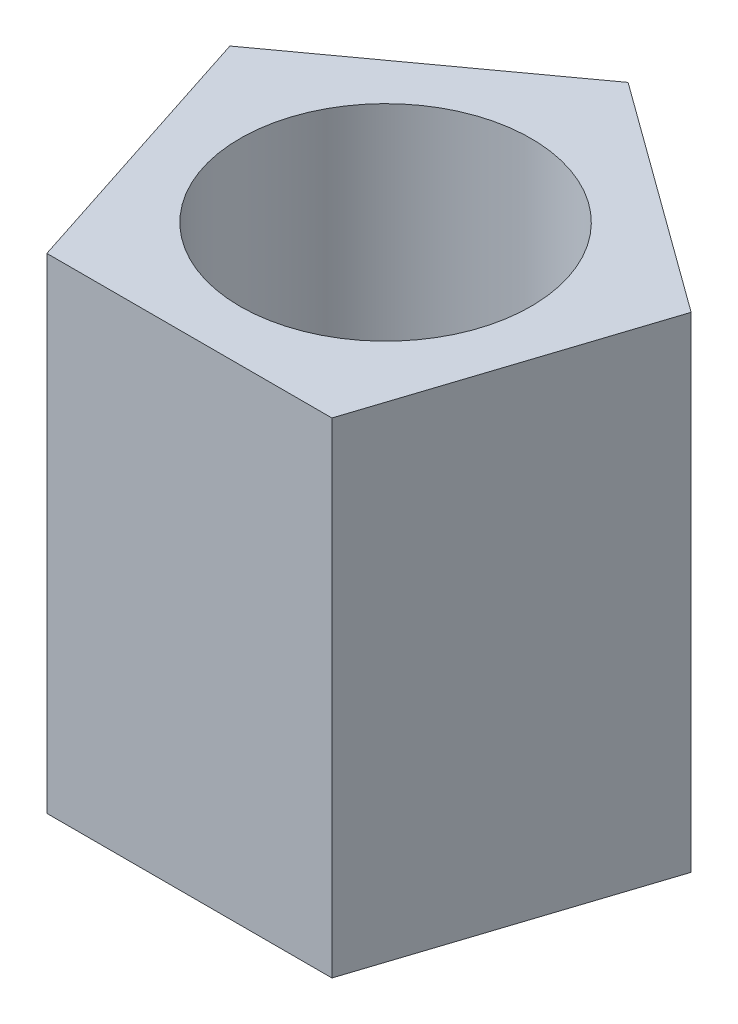
ISO-10303-21;
HEADER;
FILE_DESCRIPTION(('STEP AP214'),'2;1');
FILE_NAME('part.step','',(''),(''),'','','');
FILE_SCHEMA(('AUTOMOTIVE_DESIGN { 1 0 10303 214 1 1 1 1 }'));
ENDSEC;
DATA;
#1=APPLICATION_CONTEXT('core data for automotive mechanical design processes');
#2=APPLICATION_PROTOCOL_DEFINITION('international standard','automotive_design',2000,#1);
#3=PRODUCT_CONTEXT('',#1,'mechanical');
#4=PRODUCT('Part','Part','',(#3));
#5=PRODUCT_RELATED_PRODUCT_CATEGORY('part','',(#4));
#6=PRODUCT_DEFINITION_FORMATION('','',#4);
#7=PRODUCT_DEFINITION_CONTEXT('part definition',#1,'design');
#8=PRODUCT_DEFINITION('design','',#6,#7);
#9=PRODUCT_DEFINITION_SHAPE('','',#8);
#10=(LENGTH_UNIT() NAMED_UNIT(*) SI_UNIT(.MILLI.,.METRE.));
#11=(NAMED_UNIT(*) PLANE_ANGLE_UNIT() SI_UNIT($,.RADIAN.));
#12=(NAMED_UNIT(*) SI_UNIT($,.STERADIAN.) SOLID_ANGLE_UNIT());
#13=UNCERTAINTY_MEASURE_WITH_UNIT(LENGTH_MEASURE(1.E-05),#10,'distance_accuracy_value','');
#14=(GEOMETRIC_REPRESENTATION_CONTEXT(3) GLOBAL_UNCERTAINTY_ASSIGNED_CONTEXT((#13)) GLOBAL_UNIT_ASSIGNED_CONTEXT((#10,
#11,#12)) REPRESENTATION_CONTEXT('',''));
#15=CARTESIAN_POINT('',(0.,0.,0.));
#16=DIRECTION('',(0.,0.,1.));
#17=DIRECTION('',(1.,0.,0.));
#18=AXIS2_PLACEMENT_3D('',#15,#16,#17);
#19=CARTESIAN_POINT('',(6.03920887847423,22.0206850004623,-1.9622579142809));
#20=DIRECTION('',(0.951056516295152,0.,0.309016994374951));
#21=DIRECTION('',(0.309016994374951,0.,-0.951056516295152));
#22=AXIS2_PLACEMENT_3D('',#19,#20,#21);
#23=PLANE('',#22);
#24=DIRECTION('',(0.,-1.,0.));
#25=VECTOR('',#24,1.);
#26=CARTESIAN_POINT('',(6.03920887847423,21.4632496185971,-1.9622579142809));
#27=LINE('',#26,#25);
#28=CARTESIAN_POINT('',(6.03920887847423,12.7,-1.9622579142809));
#29=VERTEX_POINT('',#28);
#30=CARTESIAN_POINT('',(6.03920887847423,0.,-1.9622579142809));
#31=VERTEX_POINT('',#30);
#32=EDGE_CURVE('E48',#29,#31,#27,.T.);
#33=ORIENTED_EDGE('',*,*,#32,.F.);
#34=DIRECTION('',(-0.309016994374951,0.,0.951056516295152));
#35=VECTOR('',#34,1.);
#36=CARTESIAN_POINT('',(6.03920887847423,12.7,-1.9622579142809));
#37=LINE('',#36,#35);
#38=CARTESIAN_POINT('',(3.73243635205718,12.7,5.13725791428094));
#39=VERTEX_POINT('',#38);
#40=EDGE_CURVE('E122',#29,#39,#37,.T.);
#41=ORIENTED_EDGE('',*,*,#40,.T.);
#42=DIRECTION('',(0.,-1.,0.));
#43=VECTOR('',#42,1.);
#44=CARTESIAN_POINT('',(3.73243635205718,22.0206850004623,5.13725791428094));
#45=LINE('',#44,#43);
#46=CARTESIAN_POINT('',(3.73243635205718,0.,5.13725791428094));
#47=VERTEX_POINT('',#46);
#48=EDGE_CURVE('E86',#39,#47,#45,.T.);
#49=ORIENTED_EDGE('',*,*,#48,.T.);
#50=DIRECTION('',(-0.309016994374951,0.,0.951056516295153));
#51=VECTOR('',#50,1.);
#52=CARTESIAN_POINT('',(6.03920887847423,0.,-1.9622579142809));
#53=LINE('',#52,#51);
#54=EDGE_CURVE('E120',#31,#47,#53,.T.);
#55=ORIENTED_EDGE('',*,*,#54,.F.);
#56=EDGE_LOOP('',(#33,#41,#49,#55));
#57=FACE_BOUND('',#56,.T.);
#58=ADVANCED_FACE('F39',(#57),#23,.T.);
#59=CARTESIAN_POINT('',(3.73243635205718,21.7617737428428,5.13725791428094));
#60=DIRECTION('',(0.,0.,1.));
#61=DIRECTION('',(1.,0.,0.));
#62=AXIS2_PLACEMENT_3D('',#59,#60,#61);
#63=PLANE('',#62);
#64=ORIENTED_EDGE('',*,*,#48,.F.);
#65=DIRECTION('',(-1.,0.,0.));
#66=VECTOR('',#65,1.);
#67=CARTESIAN_POINT('',(3.73243635205718,12.7,5.13725791428094));
#68=LINE('',#67,#66);
#69=CARTESIAN_POINT('',(-3.73243635205725,12.7,5.13725791428088));
#70=VERTEX_POINT('',#69);
#71=EDGE_CURVE('E114',#39,#70,#68,.T.);
#72=ORIENTED_EDGE('',*,*,#71,.T.);
#73=DIRECTION('',(0.,-1.,0.));
#74=VECTOR('',#73,1.);
#75=CARTESIAN_POINT('',(-3.73243635205725,21.7617737428428,5.13725791428088));
#76=LINE('',#75,#74);
#77=CARTESIAN_POINT('',(-3.73243635205725,0.,5.13725791428088));
#78=VERTEX_POINT('',#77);
#79=EDGE_CURVE('E117',#70,#78,#76,.T.);
#80=ORIENTED_EDGE('',*,*,#79,.T.);
#81=DIRECTION('',(-1.,0.,0.));
#82=VECTOR('',#81,1.);
#83=CARTESIAN_POINT('',(3.73243635205718,0.,5.13725791428094));
#84=LINE('',#83,#82);
#85=EDGE_CURVE('E112',#47,#78,#84,.T.);
#86=ORIENTED_EDGE('',*,*,#85,.F.);
#87=EDGE_LOOP('',(#64,#72,#80,#86));
#88=FACE_BOUND('',#87,.T.);
#89=ADVANCED_FACE('F133',(#88),#63,.T.);
#90=CARTESIAN_POINT('',(-3.73243635205725,22.0206850004623,5.13725791428088));
#91=DIRECTION('',(-0.951056516295157,0.,0.309016994374938));
#92=DIRECTION('',(0.309016994374938,0.,0.951056516295157));
#93=AXIS2_PLACEMENT_3D('',#90,#91,#92);
#94=PLANE('',#93);
#95=ORIENTED_EDGE('',*,*,#79,.F.);
#96=DIRECTION('',(-0.309016994374938,0.,-0.951056516295157));
#97=VECTOR('',#96,1.);
#98=CARTESIAN_POINT('',(-3.73243635205725,12.7,5.13725791428088));
#99=LINE('',#98,#97);
#100=CARTESIAN_POINT('',(-6.0392088784742,12.7,-1.96225791428098));
#101=VERTEX_POINT('',#100);
#102=EDGE_CURVE('E107',#70,#101,#99,.T.);
#103=ORIENTED_EDGE('',*,*,#102,.T.);
#104=DIRECTION('',(0.,-1.,0.));
#105=VECTOR('',#104,1.);
#106=CARTESIAN_POINT('',(-6.0392088784742,22.0206850004623,-1.96225791428099));
#107=LINE('',#106,#105);
#108=CARTESIAN_POINT('',(-6.0392088784742,0.,-1.96225791428099));
#109=VERTEX_POINT('',#108);
#110=EDGE_CURVE('E110',#101,#109,#107,.T.);
#111=ORIENTED_EDGE('',*,*,#110,.T.);
#112=DIRECTION('',(-0.309016994374938,0.,-0.951056516295157));
#113=VECTOR('',#112,1.);
#114=CARTESIAN_POINT('',(-3.73243635205725,0.,5.13725791428088));
#115=LINE('',#114,#113);
#116=EDGE_CURVE('E97',#78,#109,#115,.T.);
#117=ORIENTED_EDGE('',*,*,#116,.F.);
#118=EDGE_LOOP('',(#95,#103,#111,#117));
#119=FACE_BOUND('',#118,.T.);
#120=ADVANCED_FACE('F136',(#119),#94,.T.);
#121=CARTESIAN_POINT('',(-6.0392088784742,21.4632496185971,-1.96225791428098));
#122=DIRECTION('',(-0.587785252292463,0.,-0.809016994374955));
#123=DIRECTION('',(-0.809016994374955,0.,0.587785252292463));
#124=AXIS2_PLACEMENT_3D('',#121,#122,#123);
#125=PLANE('',#124);
#126=ORIENTED_EDGE('',*,*,#110,.F.);
#127=DIRECTION('',(0.809016994374955,0.,-0.587785252292463));
#128=VECTOR('',#127,1.);
#129=CARTESIAN_POINT('',(-6.0392088784742,12.7,-1.96225791428098));
#130=LINE('',#129,#128);
#131=CARTESIAN_POINT('',(0.,12.7,-6.35));
#132=VERTEX_POINT('',#131);
#133=EDGE_CURVE('E93',#101,#132,#130,.T.);
#134=ORIENTED_EDGE('',*,*,#133,.T.);
#135=DIRECTION('',(0.,-1.,0.));
#136=VECTOR('',#135,1.);
#137=CARTESIAN_POINT('',(0.,21.4632496185971,-6.35));
#138=LINE('',#137,#136);
#139=CARTESIAN_POINT('',(0.,0.,-6.35));
#140=VERTEX_POINT('',#139);
#141=EDGE_CURVE('E11',#132,#140,#138,.T.);
#142=ORIENTED_EDGE('',*,*,#141,.T.);
#143=DIRECTION('',(0.809016994374955,0.,-0.587785252292463));
#144=VECTOR('',#143,1.);
#145=CARTESIAN_POINT('',(-6.0392088784742,0.,-1.96225791428098));
#146=LINE('',#145,#144);
#147=EDGE_CURVE('E91',#109,#140,#146,.T.);
#148=ORIENTED_EDGE('',*,*,#147,.F.);
#149=EDGE_LOOP('',(#126,#134,#142,#148));
#150=FACE_BOUND('',#149,.T.);
#151=ADVANCED_FACE('F90',(#150),#125,.T.);
#152=CARTESIAN_POINT('',(0.,12.7,0.));
#153=DIRECTION('',(0.,1.,0.));
#154=DIRECTION('',(0.,0.,1.));
#155=AXIS2_PLACEMENT_3D('',#152,#153,#154);
#156=PLANE('',#155);
#157=CARTESIAN_POINT('',(0.,12.7,0.));
#158=DIRECTION('',(0.,1.,0.));
#159=DIRECTION('',(0.,0.,1.));
#160=AXIS2_PLACEMENT_3D('',#157,#158,#159);
#161=CIRCLE('',#160,3.81);
#162=CARTESIAN_POINT('',(0.,12.7,3.81));
#163=VERTEX_POINT('',#162);
#164=EDGE_CURVE('E102',#163,#163,#161,.T.);
#165=ORIENTED_EDGE('',*,*,#164,.F.);
#166=EDGE_LOOP('',(#165));
#167=FACE_BOUND('',#166,.T.);
#168=ORIENTED_EDGE('',*,*,#40,.F.);
#169=DIRECTION('',(0.809016994374947,0.,0.587785252292474));
#170=VECTOR('',#169,1.);
#171=CARTESIAN_POINT('',(0.,12.7,-6.35));
#172=LINE('',#171,#170);
#173=EDGE_CURVE('E85',#132,#29,#172,.T.);
#174=ORIENTED_EDGE('',*,*,#173,.F.);
#175=ORIENTED_EDGE('',*,*,#133,.F.);
#176=ORIENTED_EDGE('',*,*,#102,.F.);
#177=ORIENTED_EDGE('',*,*,#71,.F.);
#178=EDGE_LOOP('',(#168,#174,#175,#176,#177));
#179=FACE_BOUND('',#178,.T.);
#180=ADVANCED_FACE('F41',(#167,#179),#156,.T.);
#181=CARTESIAN_POINT('',(0.,0.,0.));
#182=DIRECTION('',(0.,1.,0.));
#183=DIRECTION('',(0.,0.,1.));
#184=AXIS2_PLACEMENT_3D('',#181,#182,#183);
#185=PLANE('',#184);
#186=CARTESIAN_POINT('',(0.,0.,0.));
#187=DIRECTION('',(0.,1.,0.));
#188=DIRECTION('',(0.,0.,1.));
#189=AXIS2_PLACEMENT_3D('',#186,#187,#188);
#190=CIRCLE('',#189,3.81);
#191=CARTESIAN_POINT('',(0.,0.,3.81));
#192=VERTEX_POINT('',#191);
#193=EDGE_CURVE('E98',#192,#192,#190,.T.);
#194=ORIENTED_EDGE('',*,*,#193,.T.);
#195=EDGE_LOOP('',(#194));
#196=FACE_BOUND('',#195,.T.);
#197=DIRECTION('',(0.809016994374947,0.,0.587785252292474));
#198=VECTOR('',#197,1.);
#199=CARTESIAN_POINT('',(0.,0.,-6.35));
#200=LINE('',#199,#198);
#201=EDGE_CURVE('E78',#140,#31,#200,.T.);
#202=ORIENTED_EDGE('',*,*,#201,.T.);
#203=ORIENTED_EDGE('',*,*,#54,.T.);
#204=ORIENTED_EDGE('',*,*,#85,.T.);
#205=ORIENTED_EDGE('',*,*,#116,.T.);
#206=ORIENTED_EDGE('',*,*,#147,.T.);
#207=EDGE_LOOP('',(#202,#203,#204,#205,#206));
#208=FACE_BOUND('',#207,.T.);
#209=ADVANCED_FACE('F95',(#196,#208),#185,.F.);
#210=CARTESIAN_POINT('',(0.,21.4632496185971,-6.35));
#211=DIRECTION('',(0.587785252292474,0.,-0.809016994374947));
#212=DIRECTION('',(-0.809016994374947,0.,-0.587785252292474));
#213=AXIS2_PLACEMENT_3D('',#210,#211,#212);
#214=PLANE('',#213);
#215=ORIENTED_EDGE('',*,*,#141,.F.);
#216=ORIENTED_EDGE('',*,*,#173,.T.);
#217=ORIENTED_EDGE('',*,*,#32,.T.);
#218=ORIENTED_EDGE('',*,*,#201,.F.);
#219=EDGE_LOOP('',(#215,#216,#217,#218));
#220=FACE_BOUND('',#219,.T.);
#221=ADVANCED_FACE('F79',(#220),#214,.T.);
#222=CARTESIAN_POINT('',(0.,0.,0.));
#223=DIRECTION('',(0.,1.,0.));
#224=DIRECTION('',(0.,0.,1.));
#225=AXIS2_PLACEMENT_3D('',#222,#223,#224);
#226=CYLINDRICAL_SURFACE('',#225,3.81);
#227=ORIENTED_EDGE('',*,*,#193,.F.);
#228=EDGE_LOOP('',(#227));
#229=FACE_BOUND('',#228,.T.);
#230=ORIENTED_EDGE('',*,*,#164,.T.);
#231=EDGE_LOOP('',(#230));
#232=FACE_BOUND('',#231,.T.);
#233=ADVANCED_FACE('F153',(#229,#232),#226,.F.);
#234=CLOSED_SHELL('',(#58,#89,#120,#151,#180,#209,#221,#233));
#235=MANIFOLD_SOLID_BREP('B2',#234);
#236=ADVANCED_BREP_SHAPE_REPRESENTATION('',(#18,#235),#14);
#237=SHAPE_DEFINITION_REPRESENTATION(#9,#236);
ENDSEC;
END-ISO-10303-21;
